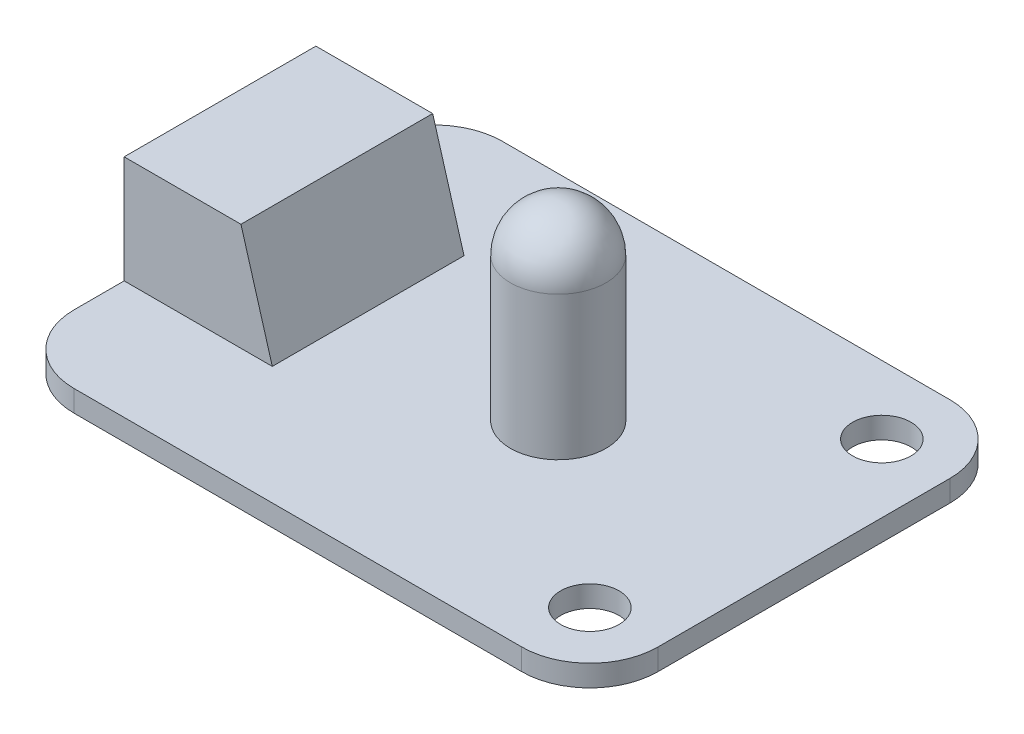
ISO-10303-21;
HEADER;
FILE_DESCRIPTION(('STEP AP214'),'2;1');
FILE_NAME('part.step','',(''),(''),'','','');
FILE_SCHEMA(('AUTOMOTIVE_DESIGN { 1 0 10303 214 1 1 1 1 }'));
ENDSEC;
DATA;
#1=APPLICATION_CONTEXT('core data for automotive mechanical design processes');
#2=APPLICATION_PROTOCOL_DEFINITION('international standard','automotive_design',2000,#1);
#3=PRODUCT_CONTEXT('',#1,'mechanical');
#4=PRODUCT('Part','Part','',(#3));
#5=PRODUCT_RELATED_PRODUCT_CATEGORY('part','',(#4));
#6=PRODUCT_DEFINITION_FORMATION('','',#4);
#7=PRODUCT_DEFINITION_CONTEXT('part definition',#1,'design');
#8=PRODUCT_DEFINITION('design','',#6,#7);
#9=PRODUCT_DEFINITION_SHAPE('','',#8);
#10=(LENGTH_UNIT() NAMED_UNIT(*) SI_UNIT(.MILLI.,.METRE.));
#11=(NAMED_UNIT(*) PLANE_ANGLE_UNIT() SI_UNIT($,.RADIAN.));
#12=(NAMED_UNIT(*) SI_UNIT($,.STERADIAN.) SOLID_ANGLE_UNIT());
#13=UNCERTAINTY_MEASURE_WITH_UNIT(LENGTH_MEASURE(1.E-05),#10,'distance_accuracy_value','');
#14=(GEOMETRIC_REPRESENTATION_CONTEXT(3) GLOBAL_UNCERTAINTY_ASSIGNED_CONTEXT((#13)) GLOBAL_UNIT_ASSIGNED_CONTEXT((#10,
#11,#12)) REPRESENTATION_CONTEXT('',''));
#15=CARTESIAN_POINT('',(0.,0.,0.));
#16=DIRECTION('',(0.,0.,1.));
#17=DIRECTION('',(1.,0.,0.));
#18=AXIS2_PLACEMENT_3D('',#15,#16,#17);
#19=CARTESIAN_POINT('',(26.5,1.1,-3.5));
#20=DIRECTION('',(0.,1.,0.));
#21=DIRECTION('',(0.,0.,1.));
#22=AXIS2_PLACEMENT_3D('',#19,#20,#21);
#23=PLANE('',#22);
#24=DIRECTION('',(0.,0.,-1.));
#25=VECTOR('',#24,1.);
#26=CARTESIAN_POINT('',(7.61,1.1,-6.075));
#27=LINE('',#26,#25);
#28=CARTESIAN_POINT('',(7.61,1.1,-6.075));
#29=VERTEX_POINT('',#28);
#30=CARTESIAN_POINT('',(7.61,1.1,-15.925));
#31=VERTEX_POINT('',#30);
#32=EDGE_CURVE('E268',#29,#31,#27,.T.);
#33=ORIENTED_EDGE('',*,*,#32,.F.);
#34=DIRECTION('',(1.,0.,0.));
#35=VECTOR('',#34,1.);
#36=CARTESIAN_POINT('',(6.,1.1,-6.075));
#37=LINE('',#36,#35);
#38=CARTESIAN_POINT('',(0.,1.1,-6.075));
#39=VERTEX_POINT('',#38);
#40=EDGE_CURVE('E135',#39,#29,#37,.T.);
#41=ORIENTED_EDGE('',*,*,#40,.F.);
#42=DIRECTION('',(0.,0.,1.));
#43=VECTOR('',#42,1.);
#44=CARTESIAN_POINT('',(0.,1.1,-18.5));
#45=LINE('',#44,#43);
#46=CARTESIAN_POINT('',(0.,1.1,-3.50000000000002));
#47=VERTEX_POINT('',#46);
#48=EDGE_CURVE('E127',#39,#47,#45,.T.);
#49=ORIENTED_EDGE('',*,*,#48,.T.);
#50=CARTESIAN_POINT('',(3.5,1.1,-3.5));
#51=DIRECTION('',(0.,1.,0.));
#52=DIRECTION('',(0.,0.,-1.));
#53=AXIS2_PLACEMENT_3D('',#50,#51,#52);
#54=CIRCLE('',#53,3.5);
#55=CARTESIAN_POINT('',(3.50000000000002,1.1,0.));
#56=VERTEX_POINT('',#55);
#57=EDGE_CURVE('E132',#47,#56,#54,.T.);
#58=ORIENTED_EDGE('',*,*,#57,.T.);
#59=DIRECTION('',(1.,0.,0.));
#60=VECTOR('',#59,1.);
#61=CARTESIAN_POINT('',(3.50000000000002,1.1,0.));
#62=LINE('',#61,#60);
#63=CARTESIAN_POINT('',(26.5,1.1,0.));
#64=VERTEX_POINT('',#63);
#65=EDGE_CURVE('E70',#56,#64,#62,.T.);
#66=ORIENTED_EDGE('',*,*,#65,.T.);
#67=CARTESIAN_POINT('',(26.5,1.1,-3.5));
#68=DIRECTION('',(0.,1.,0.));
#69=DIRECTION('',(0.,0.,1.));
#70=AXIS2_PLACEMENT_3D('',#67,#68,#69);
#71=CIRCLE('',#70,3.5);
#72=CARTESIAN_POINT('',(30.,1.1,-3.50000000000002));
#73=VERTEX_POINT('',#72);
#74=EDGE_CURVE('E187',#64,#73,#71,.T.);
#75=ORIENTED_EDGE('',*,*,#74,.T.);
#76=DIRECTION('',(0.,0.,-1.));
#77=VECTOR('',#76,1.);
#78=CARTESIAN_POINT('',(30.,1.1,-3.50000000000002));
#79=LINE('',#78,#77);
#80=CARTESIAN_POINT('',(30.,1.1,-18.5));
#81=VERTEX_POINT('',#80);
#82=EDGE_CURVE('E111',#73,#81,#79,.T.);
#83=ORIENTED_EDGE('',*,*,#82,.T.);
#84=CARTESIAN_POINT('',(26.5,1.1,-18.5));
#85=DIRECTION('',(0.,1.,0.));
#86=DIRECTION('',(0.,0.,1.));
#87=AXIS2_PLACEMENT_3D('',#84,#85,#86);
#88=CIRCLE('',#87,3.5);
#89=CARTESIAN_POINT('',(26.5,1.1,-22.));
#90=VERTEX_POINT('',#89);
#91=EDGE_CURVE('E209',#81,#90,#88,.T.);
#92=ORIENTED_EDGE('',*,*,#91,.T.);
#93=DIRECTION('',(-1.,0.,0.));
#94=VECTOR('',#93,1.);
#95=CARTESIAN_POINT('',(26.5,1.1,-22.));
#96=LINE('',#95,#94);
#97=CARTESIAN_POINT('',(3.50000000000002,1.1,-22.));
#98=VERTEX_POINT('',#97);
#99=EDGE_CURVE('E225',#90,#98,#96,.T.);
#100=ORIENTED_EDGE('',*,*,#99,.T.);
#101=CARTESIAN_POINT('',(3.5,1.1,-18.5));
#102=DIRECTION('',(0.,1.,0.));
#103=DIRECTION('',(0.,0.,1.));
#104=AXIS2_PLACEMENT_3D('',#101,#102,#103);
#105=CIRCLE('',#104,3.5);
#106=CARTESIAN_POINT('',(0.,1.1,-18.5));
#107=VERTEX_POINT('',#106);
#108=EDGE_CURVE('E140',#98,#107,#105,.T.);
#109=ORIENTED_EDGE('',*,*,#108,.T.);
#110=CARTESIAN_POINT('',(0.,1.1,-15.925));
#111=VERTEX_POINT('',#110);
#112=EDGE_CURVE('E62',#107,#111,#45,.T.);
#113=ORIENTED_EDGE('',*,*,#112,.T.);
#114=DIRECTION('',(-1.,0.,0.));
#115=VECTOR('',#114,1.);
#116=CARTESIAN_POINT('',(0.,1.1,-15.925));
#117=LINE('',#116,#115);
#118=EDGE_CURVE('E262',#31,#111,#117,.T.);
#119=ORIENTED_EDGE('',*,*,#118,.F.);
#120=EDGE_LOOP('',(#33,#41,#49,#58,#66,#75,#83,#92,#100,#109,#113,#119));
#121=FACE_BOUND('',#120,.T.);
#122=CARTESIAN_POINT('',(17.375,1.1,-11.));
#123=DIRECTION('',(0.,1.,0.));
#124=DIRECTION('',(0.,0.,1.));
#125=AXIS2_PLACEMENT_3D('',#122,#123,#124);
#126=CIRCLE('',#125,2.455);
#127=CARTESIAN_POINT('',(17.375,1.1,-8.545));
#128=VERTEX_POINT('',#127);
#129=EDGE_CURVE('E250',#128,#128,#126,.T.);
#130=ORIENTED_EDGE('',*,*,#129,.F.);
#131=EDGE_LOOP('',(#130));
#132=FACE_BOUND('',#131,.T.);
#133=CARTESIAN_POINT('',(26.5,1.1,-18.5));
#134=DIRECTION('',(0.,1.,0.));
#135=DIRECTION('',(0.,0.,1.));
#136=AXIS2_PLACEMENT_3D('',#133,#134,#135);
#137=CIRCLE('',#136,1.5);
#138=CARTESIAN_POINT('',(26.5,1.1,-17.));
#139=VERTEX_POINT('',#138);
#140=EDGE_CURVE('E168',#139,#139,#137,.T.);
#141=ORIENTED_EDGE('',*,*,#140,.F.);
#142=EDGE_LOOP('',(#141));
#143=FACE_BOUND('',#142,.T.);
#144=CARTESIAN_POINT('',(26.5,1.1,-3.5));
#145=DIRECTION('',(0.,1.,0.));
#146=DIRECTION('',(0.,0.,1.));
#147=AXIS2_PLACEMENT_3D('',#144,#145,#146);
#148=CIRCLE('',#147,1.5);
#149=CARTESIAN_POINT('',(26.5,1.1,-2.));
#150=VERTEX_POINT('',#149);
#151=EDGE_CURVE('E239',#150,#150,#148,.T.);
#152=ORIENTED_EDGE('',*,*,#151,.F.);
#153=EDGE_LOOP('',(#152));
#154=FACE_BOUND('',#153,.T.);
#155=ADVANCED_FACE('F45',(#121,#132,#143,#154),#23,.T.);
#156=CARTESIAN_POINT('',(26.5,0.,-3.5));
#157=DIRECTION('',(0.,1.,0.));
#158=DIRECTION('',(0.,0.,1.));
#159=AXIS2_PLACEMENT_3D('',#156,#157,#158);
#160=PLANE('',#159);
#161=CARTESIAN_POINT('',(26.5,0.,-3.5));
#162=DIRECTION('',(0.,1.,0.));
#163=DIRECTION('',(0.,0.,1.));
#164=AXIS2_PLACEMENT_3D('',#161,#162,#163);
#165=CIRCLE('',#164,3.5);
#166=CARTESIAN_POINT('',(26.5,0.,0.));
#167=VERTEX_POINT('',#166);
#168=CARTESIAN_POINT('',(30.,0.,-3.50000000000002));
#169=VERTEX_POINT('',#168);
#170=EDGE_CURVE('E163',#167,#169,#165,.T.);
#171=ORIENTED_EDGE('',*,*,#170,.F.);
#172=DIRECTION('',(1.,0.,0.));
#173=VECTOR('',#172,1.);
#174=CARTESIAN_POINT('',(3.50000000000002,0.,0.));
#175=LINE('',#174,#173);
#176=CARTESIAN_POINT('',(3.50000000000002,0.,0.));
#177=VERTEX_POINT('',#176);
#178=EDGE_CURVE('E103',#177,#167,#175,.T.);
#179=ORIENTED_EDGE('',*,*,#178,.F.);
#180=CARTESIAN_POINT('',(3.5,0.,-3.5));
#181=DIRECTION('',(0.,1.,0.));
#182=DIRECTION('',(0.,0.,-1.));
#183=AXIS2_PLACEMENT_3D('',#180,#181,#182);
#184=CIRCLE('',#183,3.5);
#185=CARTESIAN_POINT('',(0.,0.,-3.50000000000002));
#186=VERTEX_POINT('',#185);
#187=EDGE_CURVE('E182',#186,#177,#184,.T.);
#188=ORIENTED_EDGE('',*,*,#187,.F.);
#189=DIRECTION('',(0.,0.,1.));
#190=VECTOR('',#189,1.);
#191=CARTESIAN_POINT('',(0.,0.,-18.5));
#192=LINE('',#191,#190);
#193=CARTESIAN_POINT('',(0.,0.,-18.5));
#194=VERTEX_POINT('',#193);
#195=EDGE_CURVE('E147',#194,#186,#192,.T.);
#196=ORIENTED_EDGE('',*,*,#195,.F.);
#197=CARTESIAN_POINT('',(3.5,0.,-18.5));
#198=DIRECTION('',(0.,1.,0.));
#199=DIRECTION('',(0.,0.,1.));
#200=AXIS2_PLACEMENT_3D('',#197,#198,#199);
#201=CIRCLE('',#200,3.5);
#202=CARTESIAN_POINT('',(3.50000000000002,0.,-22.));
#203=VERTEX_POINT('',#202);
#204=EDGE_CURVE('E177',#203,#194,#201,.T.);
#205=ORIENTED_EDGE('',*,*,#204,.F.);
#206=DIRECTION('',(-1.,0.,0.));
#207=VECTOR('',#206,1.);
#208=CARTESIAN_POINT('',(26.5,0.,-22.));
#209=LINE('',#208,#207);
#210=CARTESIAN_POINT('',(26.5,0.,-22.));
#211=VERTEX_POINT('',#210);
#212=EDGE_CURVE('E174',#211,#203,#209,.T.);
#213=ORIENTED_EDGE('',*,*,#212,.F.);
#214=CARTESIAN_POINT('',(26.5,0.,-18.5));
#215=DIRECTION('',(0.,1.,0.));
#216=DIRECTION('',(0.,0.,1.));
#217=AXIS2_PLACEMENT_3D('',#214,#215,#216);
#218=CIRCLE('',#217,3.5);
#219=CARTESIAN_POINT('',(30.,0.,-18.5));
#220=VERTEX_POINT('',#219);
#221=EDGE_CURVE('E171',#220,#211,#218,.T.);
#222=ORIENTED_EDGE('',*,*,#221,.F.);
#223=DIRECTION('',(0.,0.,-1.));
#224=VECTOR('',#223,1.);
#225=CARTESIAN_POINT('',(30.,0.,-3.50000000000002));
#226=LINE('',#225,#224);
#227=EDGE_CURVE('E167',#169,#220,#226,.T.);
#228=ORIENTED_EDGE('',*,*,#227,.F.);
#229=EDGE_LOOP('',(#171,#179,#188,#196,#205,#213,#222,#228));
#230=FACE_BOUND('',#229,.T.);
#231=CARTESIAN_POINT('',(26.5,0.,-18.5));
#232=DIRECTION('',(0.,1.,0.));
#233=DIRECTION('',(0.,0.,1.));
#234=AXIS2_PLACEMENT_3D('',#231,#232,#233);
#235=CIRCLE('',#234,1.5);
#236=CARTESIAN_POINT('',(26.5,0.,-17.));
#237=VERTEX_POINT('',#236);
#238=EDGE_CURVE('E235',#237,#237,#235,.T.);
#239=ORIENTED_EDGE('',*,*,#238,.T.);
#240=EDGE_LOOP('',(#239));
#241=FACE_BOUND('',#240,.T.);
#242=CARTESIAN_POINT('',(26.5,0.,-3.5));
#243=DIRECTION('',(0.,1.,0.));
#244=DIRECTION('',(0.,0.,1.));
#245=AXIS2_PLACEMENT_3D('',#242,#243,#244);
#246=CIRCLE('',#245,1.5);
#247=CARTESIAN_POINT('',(26.5,0.,-2.));
#248=VERTEX_POINT('',#247);
#249=EDGE_CURVE('E243',#248,#248,#246,.T.);
#250=ORIENTED_EDGE('',*,*,#249,.T.);
#251=EDGE_LOOP('',(#250));
#252=FACE_BOUND('',#251,.T.);
#253=ADVANCED_FACE('F213',(#230,#241,#252),#160,.F.);
#254=CARTESIAN_POINT('',(26.5,1.1,-3.5));
#255=DIRECTION('',(0.,-1.,0.));
#256=DIRECTION('',(0.,0.,-1.));
#257=AXIS2_PLACEMENT_3D('',#254,#255,#256);
#258=CYLINDRICAL_SURFACE('',#257,3.5);
#259=ORIENTED_EDGE('',*,*,#170,.T.);
#260=DIRECTION('',(0.,-1.,0.));
#261=VECTOR('',#260,1.);
#262=CARTESIAN_POINT('',(30.,1.1,-3.50000000000002));
#263=LINE('',#262,#261);
#264=EDGE_CURVE('E11',#73,#169,#263,.T.);
#265=ORIENTED_EDGE('',*,*,#264,.F.);
#266=ORIENTED_EDGE('',*,*,#74,.F.);
#267=DIRECTION('',(0.,-1.,0.));
#268=VECTOR('',#267,1.);
#269=CARTESIAN_POINT('',(26.5,1.1,0.));
#270=LINE('',#269,#268);
#271=EDGE_CURVE('E159',#64,#167,#270,.T.);
#272=ORIENTED_EDGE('',*,*,#271,.T.);
#273=EDGE_LOOP('',(#259,#265,#266,#272));
#274=FACE_BOUND('',#273,.T.);
#275=ADVANCED_FACE('F333',(#274),#258,.T.);
#276=CARTESIAN_POINT('',(30.,1.1,-3.50000000000002));
#277=DIRECTION('',(-1.,0.,0.));
#278=DIRECTION('',(0.,0.,1.));
#279=AXIS2_PLACEMENT_3D('',#276,#277,#278);
#280=PLANE('',#279);
#281=ORIENTED_EDGE('',*,*,#227,.T.);
#282=DIRECTION('',(0.,-1.,0.));
#283=VECTOR('',#282,1.);
#284=CARTESIAN_POINT('',(30.,1.1,-18.5));
#285=LINE('',#284,#283);
#286=EDGE_CURVE('E55',#81,#220,#285,.T.);
#287=ORIENTED_EDGE('',*,*,#286,.F.);
#288=ORIENTED_EDGE('',*,*,#82,.F.);
#289=ORIENTED_EDGE('',*,*,#264,.T.);
#290=EDGE_LOOP('',(#281,#287,#288,#289));
#291=FACE_BOUND('',#290,.T.);
#292=ADVANCED_FACE('F352',(#291),#280,.F.);
#293=CARTESIAN_POINT('',(26.5,1.1,-18.5));
#294=DIRECTION('',(0.,-1.,0.));
#295=DIRECTION('',(0.,0.,-1.));
#296=AXIS2_PLACEMENT_3D('',#293,#294,#295);
#297=CYLINDRICAL_SURFACE('',#296,3.5);
#298=ORIENTED_EDGE('',*,*,#221,.T.);
#299=DIRECTION('',(0.,-1.,0.));
#300=VECTOR('',#299,1.);
#301=CARTESIAN_POINT('',(26.5,1.1,-22.));
#302=LINE('',#301,#300);
#303=EDGE_CURVE('E198',#90,#211,#302,.T.);
#304=ORIENTED_EDGE('',*,*,#303,.F.);
#305=ORIENTED_EDGE('',*,*,#91,.F.);
#306=ORIENTED_EDGE('',*,*,#286,.T.);
#307=EDGE_LOOP('',(#298,#304,#305,#306));
#308=FACE_BOUND('',#307,.T.);
#309=ADVANCED_FACE('F207',(#308),#297,.T.);
#310=CARTESIAN_POINT('',(26.5,1.1,-22.));
#311=DIRECTION('',(0.,0.,1.));
#312=DIRECTION('',(1.,0.,0.));
#313=AXIS2_PLACEMENT_3D('',#310,#311,#312);
#314=PLANE('',#313);
#315=ORIENTED_EDGE('',*,*,#212,.T.);
#316=DIRECTION('',(0.,-1.,0.));
#317=VECTOR('',#316,1.);
#318=CARTESIAN_POINT('',(3.50000000000002,1.1,-22.));
#319=LINE('',#318,#317);
#320=EDGE_CURVE('E194',#98,#203,#319,.T.);
#321=ORIENTED_EDGE('',*,*,#320,.F.);
#322=ORIENTED_EDGE('',*,*,#99,.F.);
#323=ORIENTED_EDGE('',*,*,#303,.T.);
#324=EDGE_LOOP('',(#315,#321,#322,#323));
#325=FACE_BOUND('',#324,.T.);
#326=ADVANCED_FACE('F218',(#325),#314,.F.);
#327=CARTESIAN_POINT('',(3.5,1.1,-18.5));
#328=DIRECTION('',(0.,-1.,0.));
#329=DIRECTION('',(0.,0.,-1.));
#330=AXIS2_PLACEMENT_3D('',#327,#328,#329);
#331=CYLINDRICAL_SURFACE('',#330,3.5);
#332=ORIENTED_EDGE('',*,*,#204,.T.);
#333=DIRECTION('',(0.,-1.,0.));
#334=VECTOR('',#333,1.);
#335=CARTESIAN_POINT('',(0.,1.1,-18.5));
#336=LINE('',#335,#334);
#337=EDGE_CURVE('E151',#107,#194,#336,.T.);
#338=ORIENTED_EDGE('',*,*,#337,.F.);
#339=ORIENTED_EDGE('',*,*,#108,.F.);
#340=ORIENTED_EDGE('',*,*,#320,.T.);
#341=EDGE_LOOP('',(#332,#338,#339,#340));
#342=FACE_BOUND('',#341,.T.);
#343=ADVANCED_FACE('F222',(#342),#331,.T.);
#344=CARTESIAN_POINT('',(0.,1.1,-18.5));
#345=DIRECTION('',(1.,0.,0.));
#346=DIRECTION('',(0.,0.,-1.));
#347=AXIS2_PLACEMENT_3D('',#344,#345,#346);
#348=PLANE('',#347);
#349=ORIENTED_EDGE('',*,*,#48,.F.);
#350=DIRECTION('',(0.,-1.,0.));
#351=VECTOR('',#350,1.);
#352=CARTESIAN_POINT('',(0.,6.62,-6.075));
#353=LINE('',#352,#351);
#354=CARTESIAN_POINT('',(0.,6.62,-6.075));
#355=VERTEX_POINT('',#354);
#356=EDGE_CURVE('E254',#355,#39,#353,.T.);
#357=ORIENTED_EDGE('',*,*,#356,.F.);
#358=DIRECTION('',(0.,0.,1.));
#359=VECTOR('',#358,1.);
#360=CARTESIAN_POINT('',(0.,6.62,-6.075));
#361=LINE('',#360,#359);
#362=CARTESIAN_POINT('',(0.,6.62,-15.925));
#363=VERTEX_POINT('',#362);
#364=EDGE_CURVE('E265',#363,#355,#361,.T.);
#365=ORIENTED_EDGE('',*,*,#364,.F.);
#366=DIRECTION('',(0.,-1.,0.));
#367=VECTOR('',#366,1.);
#368=CARTESIAN_POINT('',(0.,6.62,-15.925));
#369=LINE('',#368,#367);
#370=EDGE_CURVE('E257',#363,#111,#369,.T.);
#371=ORIENTED_EDGE('',*,*,#370,.T.);
#372=ORIENTED_EDGE('',*,*,#112,.F.);
#373=ORIENTED_EDGE('',*,*,#337,.T.);
#374=ORIENTED_EDGE('',*,*,#195,.T.);
#375=DIRECTION('',(0.,-1.,0.));
#376=VECTOR('',#375,1.);
#377=CARTESIAN_POINT('',(0.,1.1,-3.50000000000002));
#378=LINE('',#377,#376);
#379=EDGE_CURVE('E143',#47,#186,#378,.T.);
#380=ORIENTED_EDGE('',*,*,#379,.F.);
#381=EDGE_LOOP('',(#349,#357,#365,#371,#372,#373,#374,#380));
#382=FACE_BOUND('',#381,.T.);
#383=ADVANCED_FACE('F144',(#382),#348,.F.);
#384=CARTESIAN_POINT('',(3.5,1.1,-3.5));
#385=DIRECTION('',(0.,-1.,0.));
#386=DIRECTION('',(0.,0.,-1.));
#387=AXIS2_PLACEMENT_3D('',#384,#385,#386);
#388=CYLINDRICAL_SURFACE('',#387,3.5);
#389=ORIENTED_EDGE('',*,*,#187,.T.);
#390=DIRECTION('',(0.,-1.,0.));
#391=VECTOR('',#390,1.);
#392=CARTESIAN_POINT('',(3.50000000000002,1.1,0.));
#393=LINE('',#392,#391);
#394=EDGE_CURVE('E152',#56,#177,#393,.T.);
#395=ORIENTED_EDGE('',*,*,#394,.F.);
#396=ORIENTED_EDGE('',*,*,#57,.F.);
#397=ORIENTED_EDGE('',*,*,#379,.T.);
#398=EDGE_LOOP('',(#389,#395,#396,#397));
#399=FACE_BOUND('',#398,.T.);
#400=ADVANCED_FACE('F154',(#399),#388,.T.);
#401=CARTESIAN_POINT('',(3.50000000000002,1.1,0.));
#402=DIRECTION('',(0.,0.,-1.));
#403=DIRECTION('',(-1.,0.,0.));
#404=AXIS2_PLACEMENT_3D('',#401,#402,#403);
#405=PLANE('',#404);
#406=ORIENTED_EDGE('',*,*,#178,.T.);
#407=ORIENTED_EDGE('',*,*,#271,.F.);
#408=ORIENTED_EDGE('',*,*,#65,.F.);
#409=ORIENTED_EDGE('',*,*,#394,.T.);
#410=EDGE_LOOP('',(#406,#407,#408,#409));
#411=FACE_BOUND('',#410,.T.);
#412=ADVANCED_FACE('F339',(#411),#405,.F.);
#413=CARTESIAN_POINT('',(26.5,1.1,-18.5));
#414=DIRECTION('',(0.,-1.,0.));
#415=DIRECTION('',(0.,0.,-1.));
#416=AXIS2_PLACEMENT_3D('',#413,#414,#415);
#417=CYLINDRICAL_SURFACE('',#416,1.5);
#418=ORIENTED_EDGE('',*,*,#140,.T.);
#419=EDGE_LOOP('',(#418));
#420=FACE_BOUND('',#419,.T.);
#421=ORIENTED_EDGE('',*,*,#238,.F.);
#422=EDGE_LOOP('',(#421));
#423=FACE_BOUND('',#422,.T.);
#424=ADVANCED_FACE('F336',(#420,#423),#417,.F.);
#425=CARTESIAN_POINT('',(26.5,1.1,-3.5));
#426=DIRECTION('',(0.,-1.,0.));
#427=DIRECTION('',(0.,0.,-1.));
#428=AXIS2_PLACEMENT_3D('',#425,#426,#427);
#429=CYLINDRICAL_SURFACE('',#428,1.5);
#430=ORIENTED_EDGE('',*,*,#151,.T.);
#431=EDGE_LOOP('',(#430));
#432=FACE_BOUND('',#431,.T.);
#433=ORIENTED_EDGE('',*,*,#249,.F.);
#434=EDGE_LOOP('',(#433));
#435=FACE_BOUND('',#434,.T.);
#436=ADVANCED_FACE('F396',(#432,#435),#429,.F.);
#437=CARTESIAN_POINT('',(17.375,8.465,-11.));
#438=DIRECTION('',(0.,-1.,0.));
#439=DIRECTION('',(0.,0.,-1.));
#440=AXIS2_PLACEMENT_3D('',#437,#438,#439);
#441=CYLINDRICAL_SURFACE('',#440,2.455);
#442=CARTESIAN_POINT('',(17.375,8.465,-11.));
#443=DIRECTION('',(0.,1.,0.));
#444=DIRECTION('',(0.,0.,1.));
#445=AXIS2_PLACEMENT_3D('',#442,#443,#444);
#446=CIRCLE('',#445,2.455);
#447=CARTESIAN_POINT('',(17.375,8.465,-8.545));
#448=VERTEX_POINT('',#447);
#449=EDGE_CURVE('E49',#448,#448,#446,.T.);
#450=ORIENTED_EDGE('',*,*,#449,.F.);
#451=EDGE_LOOP('',(#450));
#452=FACE_BOUND('',#451,.T.);
#453=ORIENTED_EDGE('',*,*,#129,.T.);
#454=EDGE_LOOP('',(#453));
#455=FACE_BOUND('',#454,.T.);
#456=ADVANCED_FACE('F325',(#452,#455),#441,.T.);
#457=CARTESIAN_POINT('',(17.375,8.465,-11.));
#458=DIRECTION('',(0.,0.,1.));
#459=DIRECTION('',(1.,0.,0.));
#460=AXIS2_PLACEMENT_3D('',#457,#458,#459);
#461=SPHERICAL_SURFACE('',#460,2.455);
#462=CARTESIAN_POINT('',(17.375,8.465,-11.));
#463=DIRECTION('',(0.,1.,0.));
#464=DIRECTION('',(0.,0.,1.));
#465=AXIS2_PLACEMENT_3D('',#462,#463,#464);
#466=SPHERICAL_SURFACE('',#465,2.455);
#467=ORIENTED_EDGE('',*,*,#449,.T.);
#468=EDGE_LOOP('',(#467));
#469=FACE_BOUND('',#468,.T.);
#470=ADVANCED_FACE('F47',(#469),#466,.T.);
#471=CARTESIAN_POINT('',(6.,6.62,-6.075));
#472=DIRECTION('',(0.,0.,-1.));
#473=DIRECTION('',(-1.,0.,0.));
#474=AXIS2_PLACEMENT_3D('',#471,#472,#473);
#475=PLANE('',#474);
#476=ORIENTED_EDGE('',*,*,#40,.T.);
#477=DIRECTION('',(0.28,-0.96,0.));
#478=VECTOR('',#477,1.);
#479=CARTESIAN_POINT('',(7.61,1.1,-6.075));
#480=LINE('',#479,#478);
#481=CARTESIAN_POINT('',(6.,6.62,-6.075));
#482=VERTEX_POINT('',#481);
#483=EDGE_CURVE('E286',#482,#29,#480,.T.);
#484=ORIENTED_EDGE('',*,*,#483,.F.);
#485=DIRECTION('',(1.,0.,0.));
#486=VECTOR('',#485,1.);
#487=CARTESIAN_POINT('',(6.,6.62,-6.075));
#488=LINE('',#487,#486);
#489=EDGE_CURVE('E276',#355,#482,#488,.T.);
#490=ORIENTED_EDGE('',*,*,#489,.F.);
#491=ORIENTED_EDGE('',*,*,#356,.T.);
#492=EDGE_LOOP('',(#476,#484,#490,#491));
#493=FACE_BOUND('',#492,.T.);
#494=ADVANCED_FACE('F317',(#493),#475,.F.);
#495=CARTESIAN_POINT('',(0.,6.62,-15.925));
#496=DIRECTION('',(0.,0.,1.));
#497=DIRECTION('',(1.,0.,0.));
#498=AXIS2_PLACEMENT_3D('',#495,#496,#497);
#499=PLANE('',#498);
#500=ORIENTED_EDGE('',*,*,#118,.T.);
#501=ORIENTED_EDGE('',*,*,#370,.F.);
#502=DIRECTION('',(-1.,0.,0.));
#503=VECTOR('',#502,1.);
#504=CARTESIAN_POINT('',(0.,6.62,-15.925));
#505=LINE('',#504,#503);
#506=CARTESIAN_POINT('',(6.,6.62,-15.925));
#507=VERTEX_POINT('',#506);
#508=EDGE_CURVE('E261',#507,#363,#505,.T.);
#509=ORIENTED_EDGE('',*,*,#508,.F.);
#510=DIRECTION('',(0.28,-0.96,0.));
#511=VECTOR('',#510,1.);
#512=CARTESIAN_POINT('',(7.61,1.1,-15.925));
#513=LINE('',#512,#511);
#514=EDGE_CURVE('E287',#507,#31,#513,.T.);
#515=ORIENTED_EDGE('',*,*,#514,.T.);
#516=EDGE_LOOP('',(#500,#501,#509,#515));
#517=FACE_BOUND('',#516,.T.);
#518=ADVANCED_FACE('F307',(#517),#499,.F.);
#519=CARTESIAN_POINT('',(0.,6.62,0.));
#520=DIRECTION('',(0.,-1.,0.));
#521=DIRECTION('',(0.,0.,-1.));
#522=AXIS2_PLACEMENT_3D('',#519,#520,#521);
#523=PLANE('',#522);
#524=ORIENTED_EDGE('',*,*,#364,.T.);
#525=ORIENTED_EDGE('',*,*,#489,.T.);
#526=DIRECTION('',(0.,0.,-1.));
#527=VECTOR('',#526,1.);
#528=CARTESIAN_POINT('',(6.,6.62,-15.925));
#529=LINE('',#528,#527);
#530=EDGE_CURVE('E272',#482,#507,#529,.T.);
#531=ORIENTED_EDGE('',*,*,#530,.T.);
#532=ORIENTED_EDGE('',*,*,#508,.T.);
#533=EDGE_LOOP('',(#524,#525,#531,#532));
#534=FACE_BOUND('',#533,.T.);
#535=ADVANCED_FACE('F313',(#534),#523,.F.);
#536=CARTESIAN_POINT('',(7.61,1.1,-6.075));
#537=DIRECTION('',(0.96,0.28,0.));
#538=DIRECTION('',(-0.28,0.96,0.));
#539=AXIS2_PLACEMENT_3D('',#536,#537,#538);
#540=PLANE('',#539);
#541=ORIENTED_EDGE('',*,*,#514,.F.);
#542=ORIENTED_EDGE('',*,*,#530,.F.);
#543=ORIENTED_EDGE('',*,*,#483,.T.);
#544=ORIENTED_EDGE('',*,*,#32,.T.);
#545=EDGE_LOOP('',(#541,#542,#543,#544));
#546=FACE_BOUND('',#545,.T.);
#547=ADVANCED_FACE('F298',(#546),#540,.T.);
#548=CLOSED_SHELL('',(#155,#253,#275,#292,#309,#326,#343,#383,#400,#412,#424,#436,#456,#470,
#494,#518,#535,#547));
#549=MANIFOLD_SOLID_BREP('B2',#548);
#550=ADVANCED_BREP_SHAPE_REPRESENTATION('',(#18,#549),#14);
#551=SHAPE_DEFINITION_REPRESENTATION(#9,#550);
ENDSEC;
END-ISO-10303-21;
